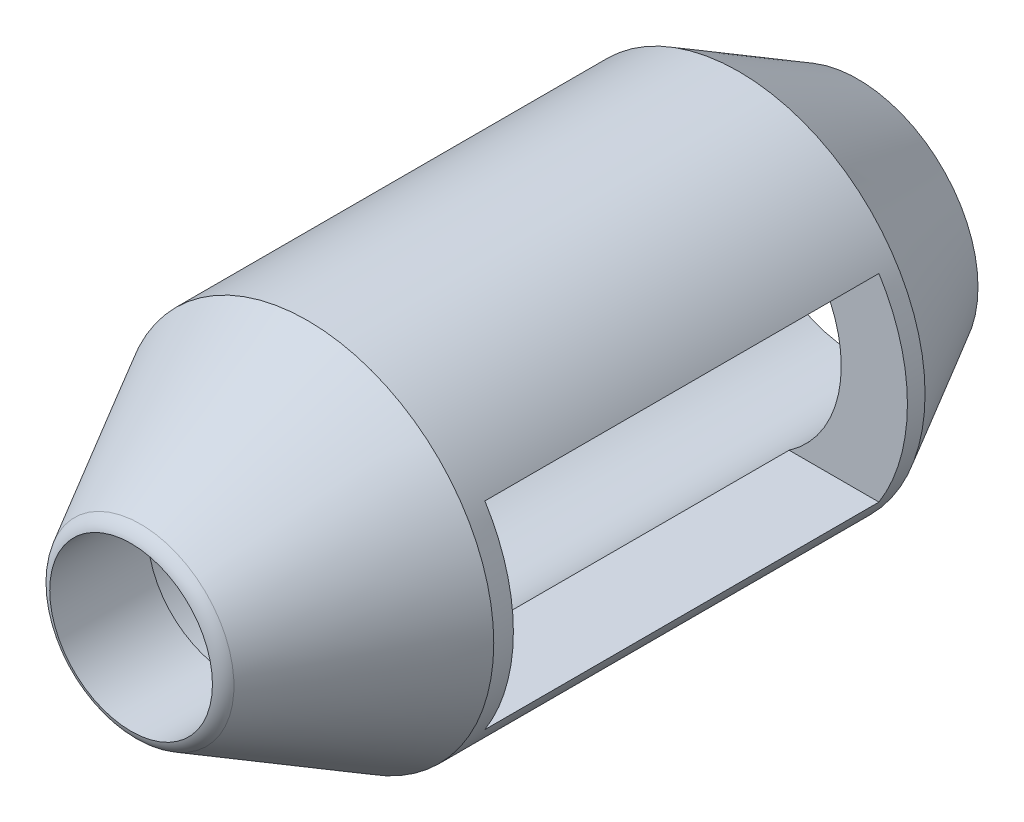
ISO-10303-21;
HEADER;
FILE_DESCRIPTION(('STEP AP214'),'2;1');
FILE_NAME('part.step','',(''),(''),'','','');
FILE_SCHEMA(('AUTOMOTIVE_DESIGN { 1 0 10303 214 1 1 1 1 }'));
ENDSEC;
DATA;
#1=APPLICATION_CONTEXT('core data for automotive mechanical design processes');
#2=APPLICATION_PROTOCOL_DEFINITION('international standard','automotive_design',2000,#1);
#3=PRODUCT_CONTEXT('',#1,'mechanical');
#4=PRODUCT('Part','Part','',(#3));
#5=PRODUCT_RELATED_PRODUCT_CATEGORY('part','',(#4));
#6=PRODUCT_DEFINITION_FORMATION('','',#4);
#7=PRODUCT_DEFINITION_CONTEXT('part definition',#1,'design');
#8=PRODUCT_DEFINITION('design','',#6,#7);
#9=PRODUCT_DEFINITION_SHAPE('','',#8);
#10=(LENGTH_UNIT() NAMED_UNIT(*) SI_UNIT(.MILLI.,.METRE.));
#11=(NAMED_UNIT(*) PLANE_ANGLE_UNIT() SI_UNIT($,.RADIAN.));
#12=(NAMED_UNIT(*) SI_UNIT($,.STERADIAN.) SOLID_ANGLE_UNIT());
#13=UNCERTAINTY_MEASURE_WITH_UNIT(LENGTH_MEASURE(1.E-05),#10,'distance_accuracy_value','');
#14=(GEOMETRIC_REPRESENTATION_CONTEXT(3) GLOBAL_UNCERTAINTY_ASSIGNED_CONTEXT((#13)) GLOBAL_UNIT_ASSIGNED_CONTEXT((#10,
#11,#12)) REPRESENTATION_CONTEXT('',''));
#15=CARTESIAN_POINT('',(0.,0.,0.));
#16=DIRECTION('',(0.,0.,1.));
#17=DIRECTION('',(1.,0.,0.));
#18=AXIS2_PLACEMENT_3D('',#15,#16,#17);
#19=CARTESIAN_POINT('',(0.,0.,40.));
#20=DIRECTION('',(0.,0.,-1.));
#21=DIRECTION('',(-1.,0.,0.));
#22=AXIS2_PLACEMENT_3D('',#19,#20,#21);
#23=CYLINDRICAL_SURFACE('',#22,4.15);
#24=CARTESIAN_POINT('',(0.,0.,40.));
#25=DIRECTION('',(0.,0.,1.));
#26=DIRECTION('',(1.,0.,0.));
#27=AXIS2_PLACEMENT_3D('',#24,#25,#26);
#28=CIRCLE('',#27,4.15);
#29=CARTESIAN_POINT('',(4.15,0.,40.));
#30=VERTEX_POINT('',#29);
#31=EDGE_CURVE('E158',#30,#30,#28,.T.);
#32=ORIENTED_EDGE('',*,*,#31,.T.);
#33=EDGE_LOOP('',(#32));
#34=FACE_BOUND('',#33,.T.);
#35=CARTESIAN_POINT('',(0.,0.,35.));
#36=DIRECTION('',(0.,0.,-1.));
#37=DIRECTION('',(-1.,0.,0.));
#38=AXIS2_PLACEMENT_3D('',#35,#36,#37);
#39=CIRCLE('',#38,4.15);
#40=CARTESIAN_POINT('',(-4.15,0.,35.));
#41=VERTEX_POINT('',#40);
#42=EDGE_CURVE('E45',#41,#41,#39,.T.);
#43=ORIENTED_EDGE('',*,*,#42,.T.);
#44=EDGE_LOOP('',(#43));
#45=FACE_BOUND('',#44,.T.);
#46=ADVANCED_FACE('F41',(#34,#45),#23,.F.);
#47=CARTESIAN_POINT('',(-9.5,-5.05,30.));
#48=DIRECTION('',(0.,-1.,0.));
#49=DIRECTION('',(0.,0.,-1.));
#50=AXIS2_PLACEMENT_3D('',#47,#48,#49);
#51=PLANE('',#50);
#52=DIRECTION('',(1.,0.,0.));
#53=VECTOR('',#52,1.);
#54=CARTESIAN_POINT('',(-9.5,-5.05,30.));
#55=LINE('',#54,#53);
#56=CARTESIAN_POINT('',(-8.04658312577457,-5.05,30.));
#57=VERTEX_POINT('',#56);
#58=CARTESIAN_POINT('',(-3.46599552798327,-5.05,30.));
#59=VERTEX_POINT('',#58);
#60=EDGE_CURVE('E133',#57,#59,#55,.T.);
#61=ORIENTED_EDGE('',*,*,#60,.T.);
#62=DIRECTION('',(0.,0.,-1.));
#63=VECTOR('',#62,1.);
#64=CARTESIAN_POINT('',(-3.46599552798327,-5.05,35.));
#65=LINE('',#64,#63);
#66=CARTESIAN_POINT('',(-3.46599552798327,-5.05,9.9));
#67=VERTEX_POINT('',#66);
#68=EDGE_CURVE('E59',#59,#67,#65,.T.);
#69=ORIENTED_EDGE('',*,*,#68,.T.);
#70=DIRECTION('',(1.,0.,0.));
#71=VECTOR('',#70,1.);
#72=CARTESIAN_POINT('',(-9.5,-5.05,9.9));
#73=LINE('',#72,#71);
#74=CARTESIAN_POINT('',(-8.04658312577457,-5.05,9.9));
#75=VERTEX_POINT('',#74);
#76=EDGE_CURVE('E143',#75,#67,#73,.T.);
#77=ORIENTED_EDGE('',*,*,#76,.F.);
#78=DIRECTION('',(0.,0.,-1.));
#79=VECTOR('',#78,1.);
#80=CARTESIAN_POINT('',(-8.04658312577457,-5.05,40.));
#81=LINE('',#80,#79);
#82=EDGE_CURVE('E170',#57,#75,#81,.T.);
#83=ORIENTED_EDGE('',*,*,#82,.F.);
#84=EDGE_LOOP('',(#61,#69,#77,#83));
#85=FACE_BOUND('',#84,.T.);
#86=ADVANCED_FACE('F235',(#85),#51,.F.);
#87=CARTESIAN_POINT('',(-9.5,5.05,30.));
#88=DIRECTION('',(0.,1.,0.));
#89=DIRECTION('',(0.,0.,1.));
#90=AXIS2_PLACEMENT_3D('',#87,#88,#89);
#91=PLANE('',#90);
#92=DIRECTION('',(1.,0.,0.));
#93=VECTOR('',#92,1.);
#94=CARTESIAN_POINT('',(-9.5,5.05,30.));
#95=LINE('',#94,#93);
#96=CARTESIAN_POINT('',(3.46599552798327,5.05,30.));
#97=VERTEX_POINT('',#96);
#98=CARTESIAN_POINT('',(8.04658312577457,5.05,30.));
#99=VERTEX_POINT('',#98);
#100=EDGE_CURVE('E140',#97,#99,#95,.T.);
#101=ORIENTED_EDGE('',*,*,#100,.F.);
#102=DIRECTION('',(0.,0.,-1.));
#103=VECTOR('',#102,1.);
#104=CARTESIAN_POINT('',(3.46599552798327,5.05,35.));
#105=LINE('',#104,#103);
#106=CARTESIAN_POINT('',(3.46599552798327,5.05,9.9));
#107=VERTEX_POINT('',#106);
#108=EDGE_CURVE('E67',#97,#107,#105,.T.);
#109=ORIENTED_EDGE('',*,*,#108,.T.);
#110=DIRECTION('',(1.,0.,0.));
#111=VECTOR('',#110,1.);
#112=CARTESIAN_POINT('',(-9.5,5.05,9.9));
#113=LINE('',#112,#111);
#114=CARTESIAN_POINT('',(8.04658312577457,5.05,9.9));
#115=VERTEX_POINT('',#114);
#116=EDGE_CURVE('E150',#107,#115,#113,.T.);
#117=ORIENTED_EDGE('',*,*,#116,.T.);
#118=DIRECTION('',(0.,0.,-1.));
#119=VECTOR('',#118,1.);
#120=CARTESIAN_POINT('',(8.04658312577457,5.05,40.));
#121=LINE('',#120,#119);
#122=EDGE_CURVE('E166',#99,#115,#121,.T.);
#123=ORIENTED_EDGE('',*,*,#122,.F.);
#124=EDGE_LOOP('',(#101,#109,#117,#123));
#125=FACE_BOUND('',#124,.T.);
#126=ADVANCED_FACE('F220',(#125),#91,.F.);
#127=CARTESIAN_POINT('',(-9.5,5.05,9.9));
#128=DIRECTION('',(0.,0.,-1.));
#129=DIRECTION('',(0.,1.,0.));
#130=AXIS2_PLACEMENT_3D('',#127,#128,#129);
#131=PLANE('',#130);
#132=ORIENTED_EDGE('',*,*,#116,.F.);
#133=CARTESIAN_POINT('',(0.,0.,9.9));
#134=DIRECTION('',(0.,0.,-1.));
#135=DIRECTION('',(0.,1.,0.));
#136=AXIS2_PLACEMENT_3D('',#133,#134,#135);
#137=CIRCLE('',#136,6.125);
#138=CARTESIAN_POINT('',(3.46599552798327,-5.05,9.9));
#139=VERTEX_POINT('',#138);
#140=EDGE_CURVE('E126',#107,#139,#137,.T.);
#141=ORIENTED_EDGE('',*,*,#140,.T.);
#142=CARTESIAN_POINT('',(8.04658312577457,-5.05,9.9));
#143=VERTEX_POINT('',#142);
#144=EDGE_CURVE('E124',#139,#143,#73,.T.);
#145=ORIENTED_EDGE('',*,*,#144,.T.);
#146=CARTESIAN_POINT('',(0.,0.,9.9));
#147=DIRECTION('',(0.,0.,-1.));
#148=DIRECTION('',(0.,1.,0.));
#149=AXIS2_PLACEMENT_3D('',#146,#147,#148);
#150=CIRCLE('',#149,9.5);
#151=EDGE_CURVE('E154',#115,#143,#150,.T.);
#152=ORIENTED_EDGE('',*,*,#151,.F.);
#153=EDGE_LOOP('',(#132,#141,#145,#152));
#154=FACE_BOUND('',#153,.T.);
#155=ADVANCED_FACE('F222',(#154),#131,.F.);
#156=CARTESIAN_POINT('',(-9.5,5.05,30.));
#157=DIRECTION('',(0.,0.,1.));
#158=DIRECTION('',(1.,0.,0.));
#159=AXIS2_PLACEMENT_3D('',#156,#157,#158);
#160=PLANE('',#159);
#161=CARTESIAN_POINT('',(-8.04658312577457,5.05,30.));
#162=VERTEX_POINT('',#161);
#163=CARTESIAN_POINT('',(-3.46599552798327,5.05,30.));
#164=VERTEX_POINT('',#163);
#165=EDGE_CURVE('E134',#162,#164,#95,.T.);
#166=ORIENTED_EDGE('',*,*,#165,.T.);
#167=CARTESIAN_POINT('',(0.,0.,30.));
#168=DIRECTION('',(0.,0.,1.));
#169=DIRECTION('',(1.,0.,0.));
#170=AXIS2_PLACEMENT_3D('',#167,#168,#169);
#171=CIRCLE('',#170,6.125);
#172=EDGE_CURVE('E117',#164,#59,#171,.T.);
#173=ORIENTED_EDGE('',*,*,#172,.T.);
#174=ORIENTED_EDGE('',*,*,#60,.F.);
#175=CARTESIAN_POINT('',(0.,0.,30.));
#176=DIRECTION('',(0.,0.,1.));
#177=DIRECTION('',(1.,0.,0.));
#178=AXIS2_PLACEMENT_3D('',#175,#176,#177);
#179=CIRCLE('',#178,9.5);
#180=EDGE_CURVE('E153',#162,#57,#179,.T.);
#181=ORIENTED_EDGE('',*,*,#180,.F.);
#182=EDGE_LOOP('',(#166,#173,#174,#181));
#183=FACE_BOUND('',#182,.T.);
#184=ADVANCED_FACE('F226',(#183),#160,.F.);
#185=CARTESIAN_POINT('',(0.,0.,40.));
#186=DIRECTION('',(0.,0.,-1.));
#187=DIRECTION('',(-1.,0.,0.));
#188=AXIS2_PLACEMENT_3D('',#185,#186,#187);
#189=CYLINDRICAL_SURFACE('',#188,9.5);
#190=CARTESIAN_POINT('',(0.,0.,9.00000000000004));
#191=DIRECTION('',(0.,0.,1.));
#192=DIRECTION('',(1.,0.,0.));
#193=AXIS2_PLACEMENT_3D('',#190,#191,#192);
#194=CIRCLE('',#193,9.5);
#195=CARTESIAN_POINT('',(9.5,0.,9.00000000000004));
#196=VERTEX_POINT('',#195);
#197=EDGE_CURVE('E51',#196,#196,#194,.T.);
#198=ORIENTED_EDGE('',*,*,#197,.T.);
#199=EDGE_LOOP('',(#198));
#200=FACE_BOUND('',#199,.T.);
#201=CARTESIAN_POINT('',(0.,0.,31.));
#202=DIRECTION('',(0.,0.,1.));
#203=DIRECTION('',(1.,0.,0.));
#204=AXIS2_PLACEMENT_3D('',#201,#202,#203);
#205=CIRCLE('',#204,9.5);
#206=CARTESIAN_POINT('',(9.5,0.,31.));
#207=VERTEX_POINT('',#206);
#208=EDGE_CURVE('E178',#207,#207,#205,.F.);
#209=ORIENTED_EDGE('',*,*,#208,.T.);
#210=EDGE_LOOP('',(#209));
#211=FACE_BOUND('',#210,.T.);
#212=DIRECTION('',(0.,0.,-1.));
#213=VECTOR('',#212,1.);
#214=CARTESIAN_POINT('',(-8.04658312577457,5.05,40.));
#215=LINE('',#214,#213);
#216=CARTESIAN_POINT('',(-8.04658312577457,5.05,9.9));
#217=VERTEX_POINT('',#216);
#218=EDGE_CURVE('E174',#217,#162,#215,.F.);
#219=ORIENTED_EDGE('',*,*,#218,.T.);
#220=ORIENTED_EDGE('',*,*,#180,.T.);
#221=ORIENTED_EDGE('',*,*,#82,.T.);
#222=EDGE_CURVE('E159',#75,#217,#150,.T.);
#223=ORIENTED_EDGE('',*,*,#222,.T.);
#224=EDGE_LOOP('',(#219,#220,#221,#223));
#225=FACE_BOUND('',#224,.T.);
#226=CARTESIAN_POINT('',(8.04658312577457,-5.05,30.));
#227=VERTEX_POINT('',#226);
#228=EDGE_CURVE('E130',#227,#99,#179,.T.);
#229=ORIENTED_EDGE('',*,*,#228,.T.);
#230=ORIENTED_EDGE('',*,*,#122,.T.);
#231=ORIENTED_EDGE('',*,*,#151,.T.);
#232=DIRECTION('',(0.,0.,-1.));
#233=VECTOR('',#232,1.);
#234=CARTESIAN_POINT('',(8.04658312577457,-5.05,40.));
#235=LINE('',#234,#233);
#236=EDGE_CURVE('E163',#143,#227,#235,.F.);
#237=ORIENTED_EDGE('',*,*,#236,.T.);
#238=EDGE_LOOP('',(#229,#230,#231,#237));
#239=FACE_BOUND('',#238,.T.);
#240=ADVANCED_FACE('F224',(#200,#211,#225,#239),#189,.T.);
#241=ORIENTED_EDGE('',*,*,#144,.F.);
#242=DIRECTION('',(0.,0.,-1.));
#243=VECTOR('',#242,1.);
#244=CARTESIAN_POINT('',(3.46599552798327,-5.05,35.));
#245=LINE('',#244,#243);
#246=CARTESIAN_POINT('',(3.46599552798327,-5.05,30.));
#247=VERTEX_POINT('',#246);
#248=EDGE_CURVE('E109',#139,#247,#245,.F.);
#249=ORIENTED_EDGE('',*,*,#248,.T.);
#250=EDGE_CURVE('E122',#247,#227,#55,.T.);
#251=ORIENTED_EDGE('',*,*,#250,.T.);
#252=ORIENTED_EDGE('',*,*,#236,.F.);
#253=EDGE_LOOP('',(#241,#249,#251,#252));
#254=FACE_BOUND('',#253,.T.);
#255=ADVANCED_FACE('F120',(#254),#51,.F.);
#256=CARTESIAN_POINT('',(-3.46599552798327,5.05,9.9));
#257=VERTEX_POINT('',#256);
#258=EDGE_CURVE('E146',#217,#257,#113,.T.);
#259=ORIENTED_EDGE('',*,*,#258,.T.);
#260=DIRECTION('',(0.,0.,-1.));
#261=VECTOR('',#260,1.);
#262=CARTESIAN_POINT('',(-3.46599552798327,5.05,35.));
#263=LINE('',#262,#261);
#264=EDGE_CURVE('E200',#257,#164,#263,.F.);
#265=ORIENTED_EDGE('',*,*,#264,.T.);
#266=ORIENTED_EDGE('',*,*,#165,.F.);
#267=ORIENTED_EDGE('',*,*,#218,.F.);
#268=EDGE_LOOP('',(#259,#265,#266,#267));
#269=FACE_BOUND('',#268,.T.);
#270=ADVANCED_FACE('F233',(#269),#91,.F.);
#271=ORIENTED_EDGE('',*,*,#76,.T.);
#272=EDGE_CURVE('E199',#67,#257,#137,.T.);
#273=ORIENTED_EDGE('',*,*,#272,.T.);
#274=ORIENTED_EDGE('',*,*,#258,.F.);
#275=ORIENTED_EDGE('',*,*,#222,.F.);
#276=EDGE_LOOP('',(#271,#273,#274,#275));
#277=FACE_BOUND('',#276,.T.);
#278=ADVANCED_FACE('F247',(#277),#131,.F.);
#279=ORIENTED_EDGE('',*,*,#250,.F.);
#280=EDGE_CURVE('E106',#247,#97,#171,.T.);
#281=ORIENTED_EDGE('',*,*,#280,.T.);
#282=ORIENTED_EDGE('',*,*,#100,.T.);
#283=ORIENTED_EDGE('',*,*,#228,.F.);
#284=EDGE_LOOP('',(#279,#281,#282,#283));
#285=FACE_BOUND('',#284,.T.);
#286=ADVANCED_FACE('F128',(#285),#160,.F.);
#287=CARTESIAN_POINT('',(0.,0.,9.00000000000004));
#288=DIRECTION('',(0.,0.,1.));
#289=DIRECTION('',(1.,0.,0.));
#290=AXIS2_PLACEMENT_3D('',#287,#288,#289);
#291=CONICAL_SURFACE('',#290,9.5,0.507098504392341);
#292=CARTESIAN_POINT('',(0.,0.,2.92500000000009));
#293=DIRECTION('',(0.,0.,1.));
#294=DIRECTION('',(1.,0.,0.));
#295=AXIS2_PLACEMENT_3D('',#292,#293,#294);
#296=CIRCLE('',#295,6.125);
#297=CARTESIAN_POINT('',(6.125,0.,2.92500000000009));
#298=VERTEX_POINT('',#297);
#299=EDGE_CURVE('E115',#298,#298,#296,.F.);
#300=ORIENTED_EDGE('',*,*,#299,.F.);
#301=EDGE_LOOP('',(#300));
#302=FACE_BOUND('',#301,.T.);
#303=ORIENTED_EDGE('',*,*,#197,.F.);
#304=EDGE_LOOP('',(#303));
#305=FACE_BOUND('',#304,.T.);
#306=ADVANCED_FACE('F253',(#302,#305),#291,.T.);
#307=CARTESIAN_POINT('',(0.,0.,40.));
#308=DIRECTION('',(0.,0.,-1.));
#309=DIRECTION('',(-1.,0.,0.));
#310=AXIS2_PLACEMENT_3D('',#307,#308,#309);
#311=CONICAL_SURFACE('',#310,4.5,0.507098504392335);
#312=CARTESIAN_POINT('',(0.,0.,39.5192514021175));
#313=DIRECTION('',(0.,0.,-1.));
#314=DIRECTION('',(-1.,0.,0.));
#315=AXIS2_PLACEMENT_3D('',#312,#313,#314);
#316=CIRCLE('',#315,4.76708255437916);
#317=CARTESIAN_POINT('',(-4.76708255437916,0.,39.5192514021175));
#318=VERTEX_POINT('',#317);
#319=EDGE_CURVE('E11',#318,#318,#316,.T.);
#320=ORIENTED_EDGE('',*,*,#319,.T.);
#321=EDGE_LOOP('',(#320));
#322=FACE_BOUND('',#321,.T.);
#323=ORIENTED_EDGE('',*,*,#208,.F.);
#324=EDGE_LOOP('',(#323));
#325=FACE_BOUND('',#324,.T.);
#326=ADVANCED_FACE('F273',(#322,#325),#311,.T.);
#327=CARTESIAN_POINT('',(0.,0.,39.0336084709389));
#328=DIRECTION('',(0.,0.,1.));
#329=DIRECTION('',(1.,0.,0.));
#330=AXIS2_PLACEMENT_3D('',#327,#328,#329);
#331=TOROIDAL_SURFACE('',#330,3.89292527825762,1.);
#332=ORIENTED_EDGE('',*,*,#319,.F.);
#333=EDGE_LOOP('',(#332));
#334=FACE_BOUND('',#333,.T.);
#335=ORIENTED_EDGE('',*,*,#31,.F.);
#336=EDGE_LOOP('',(#335));
#337=FACE_BOUND('',#336,.T.);
#338=ADVANCED_FACE('F43',(#334,#337),#331,.T.);
#339=CARTESIAN_POINT('',(0.,0.,35.));
#340=DIRECTION('',(0.,0.,-1.));
#341=DIRECTION('',(-1.,0.,0.));
#342=AXIS2_PLACEMENT_3D('',#339,#340,#341);
#343=CYLINDRICAL_SURFACE('',#342,6.125);
#344=ORIENTED_EDGE('',*,*,#299,.T.);
#345=EDGE_LOOP('',(#344));
#346=FACE_BOUND('',#345,.T.);
#347=CARTESIAN_POINT('',(0.,0.,35.));
#348=DIRECTION('',(0.,0.,-1.));
#349=DIRECTION('',(-1.,0.,0.));
#350=AXIS2_PLACEMENT_3D('',#347,#348,#349);
#351=CIRCLE('',#350,6.125);
#352=CARTESIAN_POINT('',(-6.125,0.,35.));
#353=VERTEX_POINT('',#352);
#354=EDGE_CURVE('E186',#353,#353,#351,.T.);
#355=ORIENTED_EDGE('',*,*,#354,.F.);
#356=EDGE_LOOP('',(#355));
#357=FACE_BOUND('',#356,.T.);
#358=ORIENTED_EDGE('',*,*,#108,.F.);
#359=ORIENTED_EDGE('',*,*,#280,.F.);
#360=ORIENTED_EDGE('',*,*,#248,.F.);
#361=ORIENTED_EDGE('',*,*,#140,.F.);
#362=EDGE_LOOP('',(#358,#359,#360,#361));
#363=FACE_BOUND('',#362,.T.);
#364=ORIENTED_EDGE('',*,*,#68,.F.);
#365=ORIENTED_EDGE('',*,*,#172,.F.);
#366=ORIENTED_EDGE('',*,*,#264,.F.);
#367=ORIENTED_EDGE('',*,*,#272,.F.);
#368=EDGE_LOOP('',(#364,#365,#366,#367));
#369=FACE_BOUND('',#368,.T.);
#370=ADVANCED_FACE('F108',(#346,#357,#363,#369),#343,.F.);
#371=CARTESIAN_POINT('',(0.,0.,35.));
#372=DIRECTION('',(0.,0.,-1.));
#373=DIRECTION('',(-1.,0.,0.));
#374=AXIS2_PLACEMENT_3D('',#371,#372,#373);
#375=PLANE('',#374);
#376=ORIENTED_EDGE('',*,*,#42,.F.);
#377=EDGE_LOOP('',(#376));
#378=FACE_BOUND('',#377,.T.);
#379=ORIENTED_EDGE('',*,*,#354,.T.);
#380=EDGE_LOOP('',(#379));
#381=FACE_BOUND('',#380,.T.);
#382=ADVANCED_FACE('F257',(#378,#381),#375,.T.);
#383=CLOSED_SHELL('',(#46,#86,#126,#155,#184,#240,#255,#270,#278,#286,#306,#326,#338,#370,#382));
#384=MANIFOLD_SOLID_BREP('B2',#383);
#385=ADVANCED_BREP_SHAPE_REPRESENTATION('',(#18,#384),#14);
#386=SHAPE_DEFINITION_REPRESENTATION(#9,#385);
ENDSEC;
END-ISO-10303-21;
